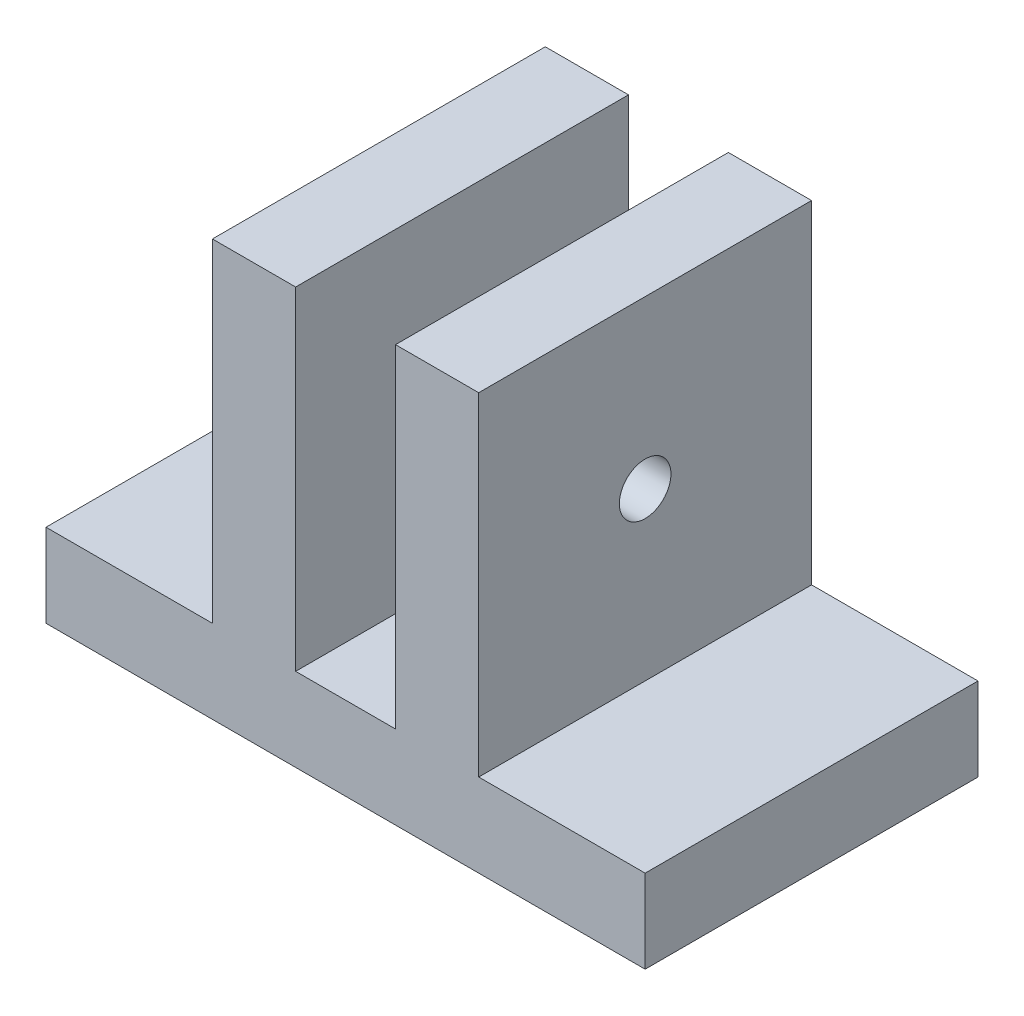
ISO-10303-21;
HEADER;
FILE_DESCRIPTION(('STEP AP214'),'2;1');
FILE_NAME('part.step','',(''),(''),'','','');
FILE_SCHEMA(('AUTOMOTIVE_DESIGN { 1 0 10303 214 1 1 1 1 }'));
ENDSEC;
DATA;
#1=APPLICATION_CONTEXT('core data for automotive mechanical design processes');
#2=APPLICATION_PROTOCOL_DEFINITION('international standard','automotive_design',2000,#1);
#3=PRODUCT_CONTEXT('',#1,'mechanical');
#4=PRODUCT('Part','Part','',(#3));
#5=PRODUCT_RELATED_PRODUCT_CATEGORY('part','',(#4));
#6=PRODUCT_DEFINITION_FORMATION('','',#4);
#7=PRODUCT_DEFINITION_CONTEXT('part definition',#1,'design');
#8=PRODUCT_DEFINITION('design','',#6,#7);
#9=PRODUCT_DEFINITION_SHAPE('','',#8);
#10=(LENGTH_UNIT() NAMED_UNIT(*) SI_UNIT(.MILLI.,.METRE.));
#11=(NAMED_UNIT(*) PLANE_ANGLE_UNIT() SI_UNIT($,.RADIAN.));
#12=(NAMED_UNIT(*) SI_UNIT($,.STERADIAN.) SOLID_ANGLE_UNIT());
#13=UNCERTAINTY_MEASURE_WITH_UNIT(LENGTH_MEASURE(1.E-05),#10,'distance_accuracy_value','');
#14=(GEOMETRIC_REPRESENTATION_CONTEXT(3) GLOBAL_UNCERTAINTY_ASSIGNED_CONTEXT((#13)) GLOBAL_UNIT_ASSIGNED_CONTEXT((#10,
#11,#12)) REPRESENTATION_CONTEXT('',''));
#15=CARTESIAN_POINT('',(0.,0.,0.));
#16=DIRECTION('',(0.,0.,1.));
#17=DIRECTION('',(1.,0.,0.));
#18=AXIS2_PLACEMENT_3D('',#15,#16,#17);
#19=CARTESIAN_POINT('',(-8.,20.,10.));
#20=DIRECTION('',(0.,-1.,0.));
#21=DIRECTION('',(0.,0.,-1.));
#22=AXIS2_PLACEMENT_3D('',#19,#20,#21);
#23=PLANE('',#22);
#24=DIRECTION('',(-1.,0.,0.));
#25=VECTOR('',#24,1.);
#26=CARTESIAN_POINT('',(-8.,20.,-10.));
#27=LINE('',#26,#25);
#28=CARTESIAN_POINT('',(-3.,20.,-10.));
#29=VERTEX_POINT('',#28);
#30=CARTESIAN_POINT('',(-8.,20.,-10.));
#31=VERTEX_POINT('',#30);
#32=EDGE_CURVE('E168',#29,#31,#27,.T.);
#33=ORIENTED_EDGE('',*,*,#32,.T.);
#34=DIRECTION('',(0.,0.,-1.));
#35=VECTOR('',#34,1.);
#36=CARTESIAN_POINT('',(-8.,20.,10.));
#37=LINE('',#36,#35);
#38=CARTESIAN_POINT('',(-8.,20.,10.));
#39=VERTEX_POINT('',#38);
#40=EDGE_CURVE('E11',#39,#31,#37,.T.);
#41=ORIENTED_EDGE('',*,*,#40,.F.);
#42=DIRECTION('',(-1.,0.,0.));
#43=VECTOR('',#42,1.);
#44=CARTESIAN_POINT('',(-8.,20.,10.));
#45=LINE('',#44,#43);
#46=CARTESIAN_POINT('',(-3.,20.,10.));
#47=VERTEX_POINT('',#46);
#48=EDGE_CURVE('E203',#47,#39,#45,.T.);
#49=ORIENTED_EDGE('',*,*,#48,.F.);
#50=DIRECTION('',(0.,0.,-1.));
#51=VECTOR('',#50,1.);
#52=CARTESIAN_POINT('',(-3.,20.,10.));
#53=LINE('',#52,#51);
#54=EDGE_CURVE('E164',#47,#29,#53,.T.);
#55=ORIENTED_EDGE('',*,*,#54,.T.);
#56=EDGE_LOOP('',(#33,#41,#49,#55));
#57=FACE_BOUND('',#56,.T.);
#58=ADVANCED_FACE('F42',(#57),#23,.F.);
#59=CARTESIAN_POINT('',(-8.,0.,10.));
#60=DIRECTION('',(1.,0.,0.));
#61=DIRECTION('',(0.,1.,0.));
#62=AXIS2_PLACEMENT_3D('',#59,#60,#61);
#63=PLANE('',#62);
#64=CARTESIAN_POINT('',(-8.,10.,0.));
#65=DIRECTION('',(1.,0.,0.));
#66=DIRECTION('',(0.,1.,0.));
#67=AXIS2_PLACEMENT_3D('',#64,#65,#66);
#68=CIRCLE('',#67,1.55);
#69=CARTESIAN_POINT('',(-8.,11.55,0.));
#70=VERTEX_POINT('',#69);
#71=EDGE_CURVE('E173',#70,#70,#68,.T.);
#72=ORIENTED_EDGE('',*,*,#71,.T.);
#73=EDGE_LOOP('',(#72));
#74=FACE_BOUND('',#73,.T.);
#75=DIRECTION('',(0.,-1.,0.));
#76=VECTOR('',#75,1.);
#77=CARTESIAN_POINT('',(-8.,0.,-10.));
#78=LINE('',#77,#76);
#79=CARTESIAN_POINT('',(-8.,0.,-10.));
#80=VERTEX_POINT('',#79);
#81=EDGE_CURVE('E172',#31,#80,#78,.T.);
#82=ORIENTED_EDGE('',*,*,#81,.T.);
#83=DIRECTION('',(0.,0.,-1.));
#84=VECTOR('',#83,1.);
#85=CARTESIAN_POINT('',(-8.,0.,10.));
#86=LINE('',#85,#84);
#87=CARTESIAN_POINT('',(-8.,0.,10.));
#88=VERTEX_POINT('',#87);
#89=EDGE_CURVE('E52',#88,#80,#86,.T.);
#90=ORIENTED_EDGE('',*,*,#89,.F.);
#91=DIRECTION('',(0.,-1.,0.));
#92=VECTOR('',#91,1.);
#93=CARTESIAN_POINT('',(-8.,0.,10.));
#94=LINE('',#93,#92);
#95=EDGE_CURVE('E115',#39,#88,#94,.T.);
#96=ORIENTED_EDGE('',*,*,#95,.F.);
#97=ORIENTED_EDGE('',*,*,#40,.T.);
#98=EDGE_LOOP('',(#82,#90,#96,#97));
#99=FACE_BOUND('',#98,.T.);
#100=ADVANCED_FACE('F302',(#74,#99),#63,.F.);
#101=CARTESIAN_POINT('',(-18.,0.,10.));
#102=DIRECTION('',(0.,-1.,0.));
#103=DIRECTION('',(0.,0.,-1.));
#104=AXIS2_PLACEMENT_3D('',#101,#102,#103);
#105=PLANE('',#104);
#106=DIRECTION('',(-1.,0.,0.));
#107=VECTOR('',#106,1.);
#108=CARTESIAN_POINT('',(-18.,0.,-10.));
#109=LINE('',#108,#107);
#110=CARTESIAN_POINT('',(-18.,0.,-10.));
#111=VERTEX_POINT('',#110);
#112=EDGE_CURVE('E176',#80,#111,#109,.T.);
#113=ORIENTED_EDGE('',*,*,#112,.T.);
#114=DIRECTION('',(0.,0.,-1.));
#115=VECTOR('',#114,1.);
#116=CARTESIAN_POINT('',(-18.,0.,10.));
#117=LINE('',#116,#115);
#118=CARTESIAN_POINT('',(-18.,0.,10.));
#119=VERTEX_POINT('',#118);
#120=EDGE_CURVE('E230',#119,#111,#117,.T.);
#121=ORIENTED_EDGE('',*,*,#120,.F.);
#122=DIRECTION('',(-1.,0.,0.));
#123=VECTOR('',#122,1.);
#124=CARTESIAN_POINT('',(-18.,0.,10.));
#125=LINE('',#124,#123);
#126=EDGE_CURVE('E241',#88,#119,#125,.T.);
#127=ORIENTED_EDGE('',*,*,#126,.F.);
#128=ORIENTED_EDGE('',*,*,#89,.T.);
#129=EDGE_LOOP('',(#113,#121,#127,#128));
#130=FACE_BOUND('',#129,.T.);
#131=ADVANCED_FACE('F239',(#130),#105,.F.);
#132=CARTESIAN_POINT('',(-18.,-5.,10.));
#133=DIRECTION('',(1.,0.,0.));
#134=DIRECTION('',(0.,0.,-1.));
#135=AXIS2_PLACEMENT_3D('',#132,#133,#134);
#136=PLANE('',#135);
#137=DIRECTION('',(0.,-1.,0.));
#138=VECTOR('',#137,1.);
#139=CARTESIAN_POINT('',(-18.,-5.,-10.));
#140=LINE('',#139,#138);
#141=CARTESIAN_POINT('',(-18.,-5.,-10.));
#142=VERTEX_POINT('',#141);
#143=EDGE_CURVE('E179',#111,#142,#140,.T.);
#144=ORIENTED_EDGE('',*,*,#143,.T.);
#145=DIRECTION('',(0.,0.,-1.));
#146=VECTOR('',#145,1.);
#147=CARTESIAN_POINT('',(-18.,-5.,10.));
#148=LINE('',#147,#146);
#149=CARTESIAN_POINT('',(-18.,-5.,10.));
#150=VERTEX_POINT('',#149);
#151=EDGE_CURVE('E226',#150,#142,#148,.T.);
#152=ORIENTED_EDGE('',*,*,#151,.F.);
#153=DIRECTION('',(0.,-1.,0.));
#154=VECTOR('',#153,1.);
#155=CARTESIAN_POINT('',(-18.,-5.,10.));
#156=LINE('',#155,#154);
#157=EDGE_CURVE('E260',#119,#150,#156,.T.);
#158=ORIENTED_EDGE('',*,*,#157,.F.);
#159=ORIENTED_EDGE('',*,*,#120,.T.);
#160=EDGE_LOOP('',(#144,#152,#158,#159));
#161=FACE_BOUND('',#160,.T.);
#162=ADVANCED_FACE('F250',(#161),#136,.F.);
#163=CARTESIAN_POINT('',(18.,-5.,10.));
#164=DIRECTION('',(0.,1.,0.));
#165=DIRECTION('',(-1.,0.,0.));
#166=AXIS2_PLACEMENT_3D('',#163,#164,#165);
#167=PLANE('',#166);
#168=DIRECTION('',(1.,0.,0.));
#169=VECTOR('',#168,1.);
#170=CARTESIAN_POINT('',(18.,-5.,-10.));
#171=LINE('',#170,#169);
#172=CARTESIAN_POINT('',(18.,-5.,-10.));
#173=VERTEX_POINT('',#172);
#174=EDGE_CURVE('E182',#142,#173,#171,.T.);
#175=ORIENTED_EDGE('',*,*,#174,.T.);
#176=DIRECTION('',(0.,0.,-1.));
#177=VECTOR('',#176,1.);
#178=CARTESIAN_POINT('',(18.,-5.,10.));
#179=LINE('',#178,#177);
#180=CARTESIAN_POINT('',(18.,-5.,10.));
#181=VERTEX_POINT('',#180);
#182=EDGE_CURVE('E222',#181,#173,#179,.T.);
#183=ORIENTED_EDGE('',*,*,#182,.F.);
#184=DIRECTION('',(1.,0.,0.));
#185=VECTOR('',#184,1.);
#186=CARTESIAN_POINT('',(18.,-5.,10.));
#187=LINE('',#186,#185);
#188=EDGE_CURVE('E256',#150,#181,#187,.T.);
#189=ORIENTED_EDGE('',*,*,#188,.F.);
#190=ORIENTED_EDGE('',*,*,#151,.T.);
#191=EDGE_LOOP('',(#175,#183,#189,#190));
#192=FACE_BOUND('',#191,.T.);
#193=ADVANCED_FACE('F254',(#192),#167,.F.);
#194=CARTESIAN_POINT('',(18.,0.,10.));
#195=DIRECTION('',(-1.,0.,0.));
#196=DIRECTION('',(0.,0.,1.));
#197=AXIS2_PLACEMENT_3D('',#194,#195,#196);
#198=PLANE('',#197);
#199=DIRECTION('',(0.,1.,0.));
#200=VECTOR('',#199,1.);
#201=CARTESIAN_POINT('',(18.,0.,-10.));
#202=LINE('',#201,#200);
#203=CARTESIAN_POINT('',(18.,0.,-10.));
#204=VERTEX_POINT('',#203);
#205=EDGE_CURVE('E185',#173,#204,#202,.T.);
#206=ORIENTED_EDGE('',*,*,#205,.T.);
#207=DIRECTION('',(0.,0.,-1.));
#208=VECTOR('',#207,1.);
#209=CARTESIAN_POINT('',(18.,0.,10.));
#210=LINE('',#209,#208);
#211=CARTESIAN_POINT('',(18.,0.,10.));
#212=VERTEX_POINT('',#211);
#213=EDGE_CURVE('E218',#212,#204,#210,.T.);
#214=ORIENTED_EDGE('',*,*,#213,.F.);
#215=DIRECTION('',(0.,1.,0.));
#216=VECTOR('',#215,1.);
#217=CARTESIAN_POINT('',(18.,0.,10.));
#218=LINE('',#217,#216);
#219=EDGE_CURVE('E259',#181,#212,#218,.T.);
#220=ORIENTED_EDGE('',*,*,#219,.F.);
#221=ORIENTED_EDGE('',*,*,#182,.T.);
#222=EDGE_LOOP('',(#206,#214,#220,#221));
#223=FACE_BOUND('',#222,.T.);
#224=ADVANCED_FACE('F319',(#223),#198,.F.);
#225=CARTESIAN_POINT('',(8.,0.,10.));
#226=DIRECTION('',(0.,-1.,0.));
#227=DIRECTION('',(1.,0.,0.));
#228=AXIS2_PLACEMENT_3D('',#225,#226,#227);
#229=PLANE('',#228);
#230=DIRECTION('',(-1.,0.,0.));
#231=VECTOR('',#230,1.);
#232=CARTESIAN_POINT('',(8.,0.,-10.));
#233=LINE('',#232,#231);
#234=CARTESIAN_POINT('',(8.,0.,-10.));
#235=VERTEX_POINT('',#234);
#236=EDGE_CURVE('E188',#204,#235,#233,.T.);
#237=ORIENTED_EDGE('',*,*,#236,.T.);
#238=DIRECTION('',(0.,0.,-1.));
#239=VECTOR('',#238,1.);
#240=CARTESIAN_POINT('',(8.,0.,10.));
#241=LINE('',#240,#239);
#242=CARTESIAN_POINT('',(8.,0.,10.));
#243=VERTEX_POINT('',#242);
#244=EDGE_CURVE('E214',#243,#235,#241,.T.);
#245=ORIENTED_EDGE('',*,*,#244,.F.);
#246=DIRECTION('',(-1.,0.,0.));
#247=VECTOR('',#246,1.);
#248=CARTESIAN_POINT('',(8.,0.,10.));
#249=LINE('',#248,#247);
#250=EDGE_CURVE('E264',#212,#243,#249,.T.);
#251=ORIENTED_EDGE('',*,*,#250,.F.);
#252=ORIENTED_EDGE('',*,*,#213,.T.);
#253=EDGE_LOOP('',(#237,#245,#251,#252));
#254=FACE_BOUND('',#253,.T.);
#255=ADVANCED_FACE('F322',(#254),#229,.F.);
#256=CARTESIAN_POINT('',(8.00000000000001,20.,10.));
#257=DIRECTION('',(-1.,0.,0.));
#258=DIRECTION('',(0.,-1.,0.));
#259=AXIS2_PLACEMENT_3D('',#256,#257,#258);
#260=PLANE('',#259);
#261=CARTESIAN_POINT('',(8.00000000000001,10.,0.));
#262=DIRECTION('',(-1.,0.,0.));
#263=DIRECTION('',(0.,-1.,0.));
#264=AXIS2_PLACEMENT_3D('',#261,#262,#263);
#265=CIRCLE('',#264,1.55);
#266=CARTESIAN_POINT('',(8.00000000000001,8.45,0.));
#267=VERTEX_POINT('',#266);
#268=EDGE_CURVE('E339',#267,#267,#265,.T.);
#269=ORIENTED_EDGE('',*,*,#268,.T.);
#270=EDGE_LOOP('',(#269));
#271=FACE_BOUND('',#270,.T.);
#272=DIRECTION('',(0.,1.,0.));
#273=VECTOR('',#272,1.);
#274=CARTESIAN_POINT('',(8.00000000000001,20.,-10.));
#275=LINE('',#274,#273);
#276=CARTESIAN_POINT('',(8.00000000000001,20.,-10.));
#277=VERTEX_POINT('',#276);
#278=EDGE_CURVE('E191',#235,#277,#275,.T.);
#279=ORIENTED_EDGE('',*,*,#278,.T.);
#280=DIRECTION('',(0.,0.,-1.));
#281=VECTOR('',#280,1.);
#282=CARTESIAN_POINT('',(8.00000000000001,20.,10.));
#283=LINE('',#282,#281);
#284=CARTESIAN_POINT('',(8.00000000000001,20.,10.));
#285=VERTEX_POINT('',#284);
#286=EDGE_CURVE('E210',#285,#277,#283,.T.);
#287=ORIENTED_EDGE('',*,*,#286,.F.);
#288=DIRECTION('',(0.,1.,0.));
#289=VECTOR('',#288,1.);
#290=CARTESIAN_POINT('',(8.00000000000001,20.,10.));
#291=LINE('',#290,#289);
#292=EDGE_CURVE('E271',#243,#285,#291,.T.);
#293=ORIENTED_EDGE('',*,*,#292,.F.);
#294=ORIENTED_EDGE('',*,*,#244,.T.);
#295=EDGE_LOOP('',(#279,#287,#293,#294));
#296=FACE_BOUND('',#295,.T.);
#297=ADVANCED_FACE('F279',(#271,#296),#260,.F.);
#298=CARTESIAN_POINT('',(3.,20.,10.));
#299=DIRECTION('',(0.,-1.,0.));
#300=DIRECTION('',(1.,0.,0.));
#301=AXIS2_PLACEMENT_3D('',#298,#299,#300);
#302=PLANE('',#301);
#303=DIRECTION('',(-1.,0.,0.));
#304=VECTOR('',#303,1.);
#305=CARTESIAN_POINT('',(3.,20.,-10.));
#306=LINE('',#305,#304);
#307=CARTESIAN_POINT('',(3.,20.,-10.));
#308=VERTEX_POINT('',#307);
#309=EDGE_CURVE('E194',#277,#308,#306,.T.);
#310=ORIENTED_EDGE('',*,*,#309,.T.);
#311=DIRECTION('',(0.,0.,-1.));
#312=VECTOR('',#311,1.);
#313=CARTESIAN_POINT('',(3.,20.,10.));
#314=LINE('',#313,#312);
#315=CARTESIAN_POINT('',(3.,20.,10.));
#316=VERTEX_POINT('',#315);
#317=EDGE_CURVE('E157',#316,#308,#314,.T.);
#318=ORIENTED_EDGE('',*,*,#317,.F.);
#319=DIRECTION('',(-1.,0.,0.));
#320=VECTOR('',#319,1.);
#321=CARTESIAN_POINT('',(3.,20.,10.));
#322=LINE('',#321,#320);
#323=EDGE_CURVE('E146',#285,#316,#322,.T.);
#324=ORIENTED_EDGE('',*,*,#323,.F.);
#325=ORIENTED_EDGE('',*,*,#286,.T.);
#326=EDGE_LOOP('',(#310,#318,#324,#325));
#327=FACE_BOUND('',#326,.T.);
#328=ADVANCED_FACE('F283',(#327),#302,.F.);
#329=CARTESIAN_POINT('',(3.,0.,10.));
#330=DIRECTION('',(1.,0.,0.));
#331=DIRECTION('',(0.,0.,-1.));
#332=AXIS2_PLACEMENT_3D('',#329,#330,#331);
#333=PLANE('',#332);
#334=CARTESIAN_POINT('',(3.,10.,0.));
#335=DIRECTION('',(1.,0.,0.));
#336=DIRECTION('',(0.,0.,-1.));
#337=AXIS2_PLACEMENT_3D('',#334,#335,#336);
#338=CIRCLE('',#337,1.55);
#339=CARTESIAN_POINT('',(3.,10.,-1.55));
#340=VERTEX_POINT('',#339);
#341=EDGE_CURVE('E336',#340,#340,#338,.T.);
#342=ORIENTED_EDGE('',*,*,#341,.T.);
#343=EDGE_LOOP('',(#342));
#344=FACE_BOUND('',#343,.T.);
#345=DIRECTION('',(0.,-1.,0.));
#346=VECTOR('',#345,1.);
#347=CARTESIAN_POINT('',(3.,0.,-10.));
#348=LINE('',#347,#346);
#349=CARTESIAN_POINT('',(3.,0.,-10.));
#350=VERTEX_POINT('',#349);
#351=EDGE_CURVE('E155',#308,#350,#348,.T.);
#352=ORIENTED_EDGE('',*,*,#351,.T.);
#353=DIRECTION('',(0.,0.,-1.));
#354=VECTOR('',#353,1.);
#355=CARTESIAN_POINT('',(3.,0.,10.));
#356=LINE('',#355,#354);
#357=CARTESIAN_POINT('',(3.,0.,10.));
#358=VERTEX_POINT('',#357);
#359=EDGE_CURVE('E152',#358,#350,#356,.T.);
#360=ORIENTED_EDGE('',*,*,#359,.F.);
#361=DIRECTION('',(0.,-1.,0.));
#362=VECTOR('',#361,1.);
#363=CARTESIAN_POINT('',(3.,0.,10.));
#364=LINE('',#363,#362);
#365=EDGE_CURVE('E140',#316,#358,#364,.T.);
#366=ORIENTED_EDGE('',*,*,#365,.F.);
#367=ORIENTED_EDGE('',*,*,#317,.T.);
#368=EDGE_LOOP('',(#352,#360,#366,#367));
#369=FACE_BOUND('',#368,.T.);
#370=ADVANCED_FACE('F153',(#344,#369),#333,.F.);
#371=CARTESIAN_POINT('',(-3.,0.,10.));
#372=DIRECTION('',(0.,-1.,0.));
#373=DIRECTION('',(1.,0.,0.));
#374=AXIS2_PLACEMENT_3D('',#371,#372,#373);
#375=PLANE('',#374);
#376=DIRECTION('',(-1.,0.,0.));
#377=VECTOR('',#376,1.);
#378=CARTESIAN_POINT('',(-3.,0.,-10.));
#379=LINE('',#378,#377);
#380=CARTESIAN_POINT('',(-3.,0.,-10.));
#381=VERTEX_POINT('',#380);
#382=EDGE_CURVE('E101',#350,#381,#379,.T.);
#383=ORIENTED_EDGE('',*,*,#382,.T.);
#384=DIRECTION('',(0.,0.,-1.));
#385=VECTOR('',#384,1.);
#386=CARTESIAN_POINT('',(-3.,0.,10.));
#387=LINE('',#386,#385);
#388=CARTESIAN_POINT('',(-3.,0.,10.));
#389=VERTEX_POINT('',#388);
#390=EDGE_CURVE('E158',#389,#381,#387,.T.);
#391=ORIENTED_EDGE('',*,*,#390,.F.);
#392=DIRECTION('',(-1.,0.,0.));
#393=VECTOR('',#392,1.);
#394=CARTESIAN_POINT('',(-3.,0.,10.));
#395=LINE('',#394,#393);
#396=EDGE_CURVE('E144',#358,#389,#395,.T.);
#397=ORIENTED_EDGE('',*,*,#396,.F.);
#398=ORIENTED_EDGE('',*,*,#359,.T.);
#399=EDGE_LOOP('',(#383,#391,#397,#398));
#400=FACE_BOUND('',#399,.T.);
#401=ADVANCED_FACE('F160',(#400),#375,.F.);
#402=CARTESIAN_POINT('',(-3.,20.,10.));
#403=DIRECTION('',(-1.,0.,0.));
#404=DIRECTION('',(0.,-1.,0.));
#405=AXIS2_PLACEMENT_3D('',#402,#403,#404);
#406=PLANE('',#405);
#407=CARTESIAN_POINT('',(-3.,10.,0.));
#408=DIRECTION('',(-1.,0.,0.));
#409=DIRECTION('',(0.,-1.,0.));
#410=AXIS2_PLACEMENT_3D('',#407,#408,#409);
#411=CIRCLE('',#410,1.55);
#412=CARTESIAN_POINT('',(-3.,8.45,0.));
#413=VERTEX_POINT('',#412);
#414=EDGE_CURVE('E45',#413,#413,#411,.T.);
#415=ORIENTED_EDGE('',*,*,#414,.T.);
#416=EDGE_LOOP('',(#415));
#417=FACE_BOUND('',#416,.T.);
#418=DIRECTION('',(0.,1.,0.));
#419=VECTOR('',#418,1.);
#420=CARTESIAN_POINT('',(-3.,20.,-10.));
#421=LINE('',#420,#419);
#422=EDGE_CURVE('E107',#381,#29,#421,.T.);
#423=ORIENTED_EDGE('',*,*,#422,.T.);
#424=ORIENTED_EDGE('',*,*,#54,.F.);
#425=DIRECTION('',(0.,1.,0.));
#426=VECTOR('',#425,1.);
#427=CARTESIAN_POINT('',(-3.,20.,10.));
#428=LINE('',#427,#426);
#429=EDGE_CURVE('E60',#389,#47,#428,.T.);
#430=ORIENTED_EDGE('',*,*,#429,.F.);
#431=ORIENTED_EDGE('',*,*,#390,.T.);
#432=EDGE_LOOP('',(#423,#424,#430,#431));
#433=FACE_BOUND('',#432,.T.);
#434=ADVANCED_FACE('F287',(#417,#433),#406,.F.);
#435=CARTESIAN_POINT('',(0.,0.,10.));
#436=DIRECTION('',(0.,0.,-1.));
#437=DIRECTION('',(-1.,0.,0.));
#438=AXIS2_PLACEMENT_3D('',#435,#436,#437);
#439=PLANE('',#438);
#440=ORIENTED_EDGE('',*,*,#48,.T.);
#441=ORIENTED_EDGE('',*,*,#95,.T.);
#442=ORIENTED_EDGE('',*,*,#126,.T.);
#443=ORIENTED_EDGE('',*,*,#157,.T.);
#444=ORIENTED_EDGE('',*,*,#188,.T.);
#445=ORIENTED_EDGE('',*,*,#219,.T.);
#446=ORIENTED_EDGE('',*,*,#250,.T.);
#447=ORIENTED_EDGE('',*,*,#292,.T.);
#448=ORIENTED_EDGE('',*,*,#323,.T.);
#449=ORIENTED_EDGE('',*,*,#365,.T.);
#450=ORIENTED_EDGE('',*,*,#396,.T.);
#451=ORIENTED_EDGE('',*,*,#429,.T.);
#452=EDGE_LOOP('',(#440,#441,#442,#443,#444,#445,#446,#447,#448,#449,#450,#451));
#453=FACE_BOUND('',#452,.T.);
#454=ADVANCED_FACE('F142',(#453),#439,.F.);
#455=CARTESIAN_POINT('',(0.,0.,-10.));
#456=DIRECTION('',(0.,0.,-1.));
#457=DIRECTION('',(-1.,0.,0.));
#458=AXIS2_PLACEMENT_3D('',#455,#456,#457);
#459=PLANE('',#458);
#460=ORIENTED_EDGE('',*,*,#32,.F.);
#461=ORIENTED_EDGE('',*,*,#422,.F.);
#462=ORIENTED_EDGE('',*,*,#382,.F.);
#463=ORIENTED_EDGE('',*,*,#351,.F.);
#464=ORIENTED_EDGE('',*,*,#309,.F.);
#465=ORIENTED_EDGE('',*,*,#278,.F.);
#466=ORIENTED_EDGE('',*,*,#236,.F.);
#467=ORIENTED_EDGE('',*,*,#205,.F.);
#468=ORIENTED_EDGE('',*,*,#174,.F.);
#469=ORIENTED_EDGE('',*,*,#143,.F.);
#470=ORIENTED_EDGE('',*,*,#112,.F.);
#471=ORIENTED_EDGE('',*,*,#81,.F.);
#472=EDGE_LOOP('',(#460,#461,#462,#463,#464,#465,#466,#467,#468,#469,#470,#471));
#473=FACE_BOUND('',#472,.T.);
#474=ADVANCED_FACE('F245',(#473),#459,.T.);
#475=CARTESIAN_POINT('',(-18.,10.,0.));
#476=DIRECTION('',(1.,0.,0.));
#477=DIRECTION('',(0.,0.,-1.));
#478=AXIS2_PLACEMENT_3D('',#475,#476,#477);
#479=CYLINDRICAL_SURFACE('',#478,1.55);
#480=ORIENTED_EDGE('',*,*,#414,.F.);
#481=EDGE_LOOP('',(#480));
#482=FACE_BOUND('',#481,.T.);
#483=ORIENTED_EDGE('',*,*,#71,.F.);
#484=EDGE_LOOP('',(#483));
#485=FACE_BOUND('',#484,.T.);
#486=ADVANCED_FACE('F354',(#482,#485),#479,.F.);
#487=ORIENTED_EDGE('',*,*,#341,.F.);
#488=EDGE_LOOP('',(#487));
#489=FACE_BOUND('',#488,.T.);
#490=ORIENTED_EDGE('',*,*,#268,.F.);
#491=EDGE_LOOP('',(#490));
#492=FACE_BOUND('',#491,.T.);
#493=ADVANCED_FACE('F356',(#489,#492),#479,.F.);
#494=CLOSED_SHELL('',(#58,#100,#131,#162,#193,#224,#255,#297,#328,#370,#401,#434,#454,#474,#486,#493));
#495=MANIFOLD_SOLID_BREP('B2',#494);
#496=ADVANCED_BREP_SHAPE_REPRESENTATION('',(#18,#495),#14);
#497=SHAPE_DEFINITION_REPRESENTATION(#9,#496);
ENDSEC;
END-ISO-10303-21;
